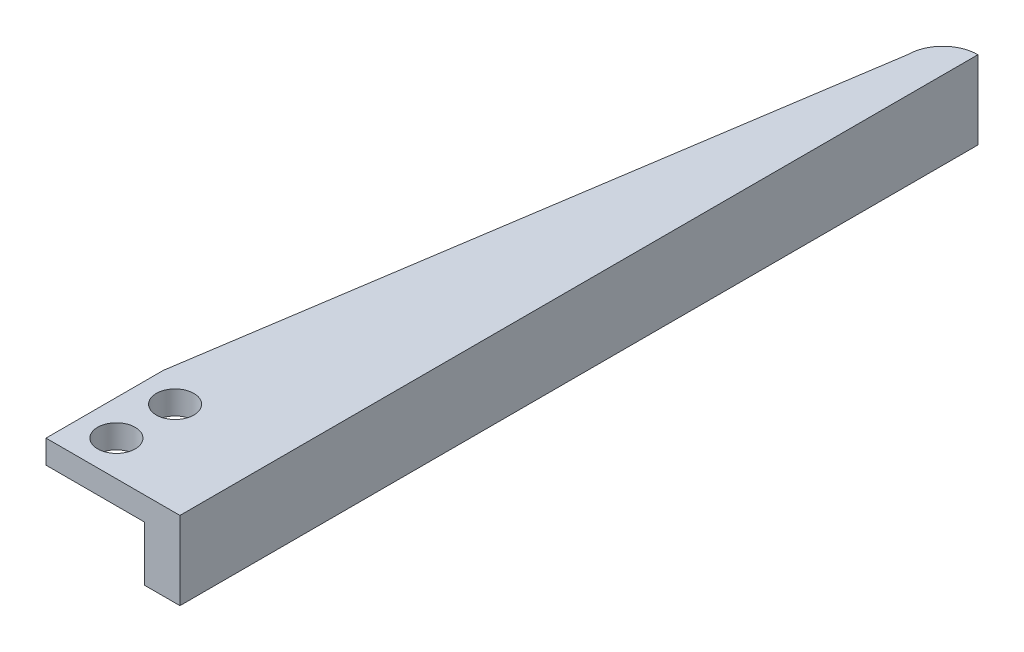
ISO-10303-21;
HEADER;
FILE_DESCRIPTION(('STEP AP214'),'2;1');
FILE_NAME('part.step','',(''),(''),'','','');
FILE_SCHEMA(('AUTOMOTIVE_DESIGN { 1 0 10303 214 1 1 1 1 }'));
ENDSEC;
DATA;
#1=APPLICATION_CONTEXT('core data for automotive mechanical design processes');
#2=APPLICATION_PROTOCOL_DEFINITION('international standard','automotive_design',2000,#1);
#3=PRODUCT_CONTEXT('',#1,'mechanical');
#4=PRODUCT('Part','Part','',(#3));
#5=PRODUCT_RELATED_PRODUCT_CATEGORY('part','',(#4));
#6=PRODUCT_DEFINITION_FORMATION('','',#4);
#7=PRODUCT_DEFINITION_CONTEXT('part definition',#1,'design');
#8=PRODUCT_DEFINITION('design','',#6,#7);
#9=PRODUCT_DEFINITION_SHAPE('','',#8);
#10=(LENGTH_UNIT() NAMED_UNIT(*) SI_UNIT(.MILLI.,.METRE.));
#11=(NAMED_UNIT(*) PLANE_ANGLE_UNIT() SI_UNIT($,.RADIAN.));
#12=(NAMED_UNIT(*) SI_UNIT($,.STERADIAN.) SOLID_ANGLE_UNIT());
#13=UNCERTAINTY_MEASURE_WITH_UNIT(LENGTH_MEASURE(1.E-05),#10,'distance_accuracy_value','');
#14=(GEOMETRIC_REPRESENTATION_CONTEXT(3) GLOBAL_UNCERTAINTY_ASSIGNED_CONTEXT((#13)) GLOBAL_UNIT_ASSIGNED_CONTEXT((#10,
#11,#12)) REPRESENTATION_CONTEXT('',''));
#15=CARTESIAN_POINT('',(0.,0.,0.));
#16=DIRECTION('',(0.,0.,1.));
#17=DIRECTION('',(1.,0.,0.));
#18=AXIS2_PLACEMENT_3D('',#15,#16,#17);
#19=CARTESIAN_POINT('',(5.70625000000002,0.,-65.));
#20=DIRECTION('',(0.,1.,0.));
#21=DIRECTION('',(0.,0.,-1.));
#22=AXIS2_PLACEMENT_3D('',#19,#20,#21);
#23=PLANE('',#22);
#24=CARTESIAN_POINT('',(-2.70625,0.,-8.));
#25=DIRECTION('',(0.,-1.,0.));
#26=DIRECTION('',(0.,0.,-1.));
#27=AXIS2_PLACEMENT_3D('',#24,#25,#26);
#28=CIRCLE('',#27,1.6);
#29=CARTESIAN_POINT('',(-2.70625,0.,-9.6));
#30=VERTEX_POINT('',#29);
#31=EDGE_CURVE('E147',#30,#30,#28,.T.);
#32=ORIENTED_EDGE('',*,*,#31,.F.);
#33=EDGE_LOOP('',(#32));
#34=FACE_BOUND('',#33,.T.);
#35=CARTESIAN_POINT('',(-2.70625,0.,-3.));
#36=DIRECTION('',(0.,-1.,0.));
#37=DIRECTION('',(0.,0.,-1.));
#38=AXIS2_PLACEMENT_3D('',#35,#36,#37);
#39=CIRCLE('',#38,1.6);
#40=CARTESIAN_POINT('',(-2.70625,0.,-4.6));
#41=VERTEX_POINT('',#40);
#42=EDGE_CURVE('E151',#41,#41,#39,.T.);
#43=ORIENTED_EDGE('',*,*,#42,.F.);
#44=EDGE_LOOP('',(#43));
#45=FACE_BOUND('',#44,.T.);
#46=DIRECTION('',(0.,0.,1.));
#47=VECTOR('',#46,1.);
#48=CARTESIAN_POINT('',(2.70625000000002,0.,-65.));
#49=LINE('',#48,#47);
#50=CARTESIAN_POINT('',(2.70625000000002,0.,-65.));
#51=VERTEX_POINT('',#50);
#52=CARTESIAN_POINT('',(2.70625000000003,0.,0.));
#53=VERTEX_POINT('',#52);
#54=EDGE_CURVE('E130',#51,#53,#49,.T.);
#55=ORIENTED_EDGE('',*,*,#54,.T.);
#56=DIRECTION('',(-1.,0.,0.));
#57=VECTOR('',#56,1.);
#58=CARTESIAN_POINT('',(-5.70625,0.,0.));
#59=LINE('',#58,#57);
#60=CARTESIAN_POINT('',(-5.70625,0.,0.));
#61=VERTEX_POINT('',#60);
#62=EDGE_CURVE('E121',#53,#61,#59,.T.);
#63=ORIENTED_EDGE('',*,*,#62,.T.);
#64=DIRECTION('',(0.,0.,-1.));
#65=VECTOR('',#64,1.);
#66=CARTESIAN_POINT('',(-5.70625,0.,0.));
#67=LINE('',#66,#65);
#68=CARTESIAN_POINT('',(-5.70625,0.,-10.));
#69=VERTEX_POINT('',#68);
#70=EDGE_CURVE('E114',#61,#69,#67,.T.);
#71=ORIENTED_EDGE('',*,*,#70,.T.);
#72=DIRECTION('',(0.151196146520445,0.,-0.988503781114351));
#73=VECTOR('',#72,1.);
#74=CARTESIAN_POINT('',(-5.70625,0.,-10.));
#75=LINE('',#74,#73);
#76=EDGE_CURVE('E117',#69,#51,#75,.T.);
#77=ORIENTED_EDGE('',*,*,#76,.T.);
#78=EDGE_LOOP('',(#55,#63,#71,#77));
#79=FACE_BOUND('',#78,.T.);
#80=ADVANCED_FACE('F35',(#34,#45,#79),#23,.F.);
#81=CARTESIAN_POINT('',(5.70625000000002,2.,-65.));
#82=DIRECTION('',(0.,1.,0.));
#83=DIRECTION('',(0.,0.,-1.));
#84=AXIS2_PLACEMENT_3D('',#81,#82,#83);
#85=PLANE('',#84);
#86=CARTESIAN_POINT('',(-2.70625,2.,-3.));
#87=DIRECTION('',(0.,-1.,0.));
#88=DIRECTION('',(0.,0.,-1.));
#89=AXIS2_PLACEMENT_3D('',#86,#87,#88);
#90=CIRCLE('',#89,1.6);
#91=CARTESIAN_POINT('',(-2.70625,2.,-4.6));
#92=VERTEX_POINT('',#91);
#93=EDGE_CURVE('E118',#92,#92,#90,.T.);
#94=ORIENTED_EDGE('',*,*,#93,.T.);
#95=EDGE_LOOP('',(#94));
#96=FACE_BOUND('',#95,.T.);
#97=DIRECTION('',(0.,0.,-1.));
#98=VECTOR('',#97,1.);
#99=CARTESIAN_POINT('',(-5.70625,2.,0.));
#100=LINE('',#99,#98);
#101=CARTESIAN_POINT('',(-5.70625,2.,0.));
#102=VERTEX_POINT('',#101);
#103=CARTESIAN_POINT('',(-5.70625,2.,-10.));
#104=VERTEX_POINT('',#103);
#105=EDGE_CURVE('E124',#102,#104,#100,.T.);
#106=ORIENTED_EDGE('',*,*,#105,.F.);
#107=DIRECTION('',(-1.,0.,0.));
#108=VECTOR('',#107,1.);
#109=CARTESIAN_POINT('',(-5.70625,2.,0.));
#110=LINE('',#109,#108);
#111=CARTESIAN_POINT('',(5.70625,2.,0.));
#112=VERTEX_POINT('',#111);
#113=EDGE_CURVE('E109',#112,#102,#110,.T.);
#114=ORIENTED_EDGE('',*,*,#113,.F.);
#115=DIRECTION('',(0.,0.,1.));
#116=VECTOR('',#115,1.);
#117=CARTESIAN_POINT('',(5.70625000000001,2.,-68.));
#118=LINE('',#117,#116);
#119=CARTESIAN_POINT('',(5.70625000000001,2.,-68.));
#120=VERTEX_POINT('',#119);
#121=EDGE_CURVE('E93',#120,#112,#118,.T.);
#122=ORIENTED_EDGE('',*,*,#121,.F.);
#123=CARTESIAN_POINT('',(5.70625000000002,2.,-65.));
#124=DIRECTION('',(0.,-1.,0.));
#125=DIRECTION('',(0.,0.,-1.));
#126=AXIS2_PLACEMENT_3D('',#123,#124,#125);
#127=CIRCLE('',#126,3.);
#128=CARTESIAN_POINT('',(2.70625000000002,2.,-65.));
#129=VERTEX_POINT('',#128);
#130=EDGE_CURVE('E101',#129,#120,#127,.T.);
#131=ORIENTED_EDGE('',*,*,#130,.F.);
#132=DIRECTION('',(0.151196146520445,0.,-0.988503781114351));
#133=VECTOR('',#132,1.);
#134=CARTESIAN_POINT('',(-5.70625,2.,-10.));
#135=LINE('',#134,#133);
#136=EDGE_CURVE('E104',#104,#129,#135,.T.);
#137=ORIENTED_EDGE('',*,*,#136,.F.);
#138=EDGE_LOOP('',(#106,#114,#122,#131,#137));
#139=FACE_BOUND('',#138,.T.);
#140=CARTESIAN_POINT('',(-2.70625,2.,-8.));
#141=DIRECTION('',(0.,-1.,0.));
#142=DIRECTION('',(0.,0.,-1.));
#143=AXIS2_PLACEMENT_3D('',#140,#141,#142);
#144=CIRCLE('',#143,1.6);
#145=CARTESIAN_POINT('',(-2.70625,2.,-9.6));
#146=VERTEX_POINT('',#145);
#147=EDGE_CURVE('E148',#146,#146,#144,.T.);
#148=ORIENTED_EDGE('',*,*,#147,.T.);
#149=EDGE_LOOP('',(#148));
#150=FACE_BOUND('',#149,.T.);
#151=ADVANCED_FACE('F107',(#96,#139,#150),#85,.T.);
#152=CARTESIAN_POINT('',(-5.70625,2.,0.));
#153=DIRECTION('',(1.,0.,0.));
#154=DIRECTION('',(0.,0.,1.));
#155=AXIS2_PLACEMENT_3D('',#152,#153,#154);
#156=PLANE('',#155);
#157=ORIENTED_EDGE('',*,*,#70,.F.);
#158=DIRECTION('',(0.,-1.,0.));
#159=VECTOR('',#158,1.);
#160=CARTESIAN_POINT('',(-5.70625,2.,0.));
#161=LINE('',#160,#159);
#162=EDGE_CURVE('E52',#102,#61,#161,.T.);
#163=ORIENTED_EDGE('',*,*,#162,.F.);
#164=ORIENTED_EDGE('',*,*,#105,.T.);
#165=DIRECTION('',(0.,-1.,0.));
#166=VECTOR('',#165,1.);
#167=CARTESIAN_POINT('',(-5.70625,2.,-10.));
#168=LINE('',#167,#166);
#169=EDGE_CURVE('E11',#104,#69,#168,.T.);
#170=ORIENTED_EDGE('',*,*,#169,.T.);
#171=EDGE_LOOP('',(#157,#163,#164,#170));
#172=FACE_BOUND('',#171,.T.);
#173=ADVANCED_FACE('F37',(#172),#156,.F.);
#174=CARTESIAN_POINT('',(-5.70625,2.,-10.));
#175=DIRECTION('',(0.988503781114351,0.,0.151196146520445));
#176=DIRECTION('',(-0.151196146520445,0.,0.988503781114351));
#177=AXIS2_PLACEMENT_3D('',#174,#175,#176);
#178=PLANE('',#177);
#179=ORIENTED_EDGE('',*,*,#76,.F.);
#180=ORIENTED_EDGE('',*,*,#169,.F.);
#181=ORIENTED_EDGE('',*,*,#136,.T.);
#182=DIRECTION('',(0.,-1.,0.));
#183=VECTOR('',#182,1.);
#184=CARTESIAN_POINT('',(2.70625000000002,2.,-65.));
#185=LINE('',#184,#183);
#186=EDGE_CURVE('E44',#129,#51,#185,.T.);
#187=ORIENTED_EDGE('',*,*,#186,.T.);
#188=EDGE_LOOP('',(#179,#180,#181,#187));
#189=FACE_BOUND('',#188,.T.);
#190=ADVANCED_FACE('F126',(#189),#178,.F.);
#191=CARTESIAN_POINT('',(5.70625000000002,2.,-65.));
#192=DIRECTION('',(0.,-1.,0.));
#193=DIRECTION('',(0.,0.,1.));
#194=AXIS2_PLACEMENT_3D('',#191,#192,#193);
#195=CYLINDRICAL_SURFACE('',#194,3.);
#196=ORIENTED_EDGE('',*,*,#186,.F.);
#197=ORIENTED_EDGE('',*,*,#130,.T.);
#198=DIRECTION('',(0.,-1.,0.));
#199=VECTOR('',#198,1.);
#200=CARTESIAN_POINT('',(5.70625000000001,2.,-68.));
#201=LINE('',#200,#199);
#202=CARTESIAN_POINT('',(5.70625000000001,-4.6625,-68.));
#203=VERTEX_POINT('',#202);
#204=EDGE_CURVE('E88',#120,#203,#201,.T.);
#205=ORIENTED_EDGE('',*,*,#204,.T.);
#206=CARTESIAN_POINT('',(5.70625000000002,-4.6625,-65.));
#207=DIRECTION('',(0.,1.,0.));
#208=DIRECTION('',(0.,0.,1.));
#209=AXIS2_PLACEMENT_3D('',#206,#207,#208);
#210=CIRCLE('',#209,3.);
#211=CARTESIAN_POINT('',(2.70625000000002,-4.6625,-65.));
#212=VERTEX_POINT('',#211);
#213=EDGE_CURVE('E138',#203,#212,#210,.T.);
#214=ORIENTED_EDGE('',*,*,#213,.T.);
#215=DIRECTION('',(0.,1.,0.));
#216=VECTOR('',#215,1.);
#217=CARTESIAN_POINT('',(2.70625000000002,-4.6625,-65.));
#218=LINE('',#217,#216);
#219=EDGE_CURVE('E67',#212,#51,#218,.T.);
#220=ORIENTED_EDGE('',*,*,#219,.T.);
#221=EDGE_LOOP('',(#196,#197,#205,#214,#220));
#222=FACE_BOUND('',#221,.T.);
#223=ADVANCED_FACE('F102',(#222),#195,.T.);
#224=CARTESIAN_POINT('',(5.70625000000001,2.,-68.));
#225=DIRECTION('',(-1.,0.,0.));
#226=DIRECTION('',(0.,0.,-1.));
#227=AXIS2_PLACEMENT_3D('',#224,#225,#226);
#228=PLANE('',#227);
#229=ORIENTED_EDGE('',*,*,#204,.F.);
#230=ORIENTED_EDGE('',*,*,#121,.T.);
#231=DIRECTION('',(0.,-1.,0.));
#232=VECTOR('',#231,1.);
#233=CARTESIAN_POINT('',(5.70625,2.,0.));
#234=LINE('',#233,#232);
#235=CARTESIAN_POINT('',(5.70625000000002,-4.6625,0.));
#236=VERTEX_POINT('',#235);
#237=EDGE_CURVE('E98',#112,#236,#234,.T.);
#238=ORIENTED_EDGE('',*,*,#237,.T.);
#239=DIRECTION('',(0.,0.,-1.));
#240=VECTOR('',#239,1.);
#241=CARTESIAN_POINT('',(5.70625000000001,-4.6625,-68.));
#242=LINE('',#241,#240);
#243=EDGE_CURVE('E96',#236,#203,#242,.T.);
#244=ORIENTED_EDGE('',*,*,#243,.T.);
#245=EDGE_LOOP('',(#229,#230,#238,#244));
#246=FACE_BOUND('',#245,.T.);
#247=ADVANCED_FACE('F90',(#246),#228,.F.);
#248=CARTESIAN_POINT('',(-5.70625,2.,0.));
#249=DIRECTION('',(0.,0.,-1.));
#250=DIRECTION('',(1.,0.,0.));
#251=AXIS2_PLACEMENT_3D('',#248,#249,#250);
#252=PLANE('',#251);
#253=ORIENTED_EDGE('',*,*,#237,.F.);
#254=ORIENTED_EDGE('',*,*,#113,.T.);
#255=ORIENTED_EDGE('',*,*,#162,.T.);
#256=ORIENTED_EDGE('',*,*,#62,.F.);
#257=DIRECTION('',(0.,1.,0.));
#258=VECTOR('',#257,1.);
#259=CARTESIAN_POINT('',(2.70625000000003,-4.6625,0.));
#260=LINE('',#259,#258);
#261=CARTESIAN_POINT('',(2.70625000000003,-4.6625,0.));
#262=VERTEX_POINT('',#261);
#263=EDGE_CURVE('E137',#262,#53,#260,.T.);
#264=ORIENTED_EDGE('',*,*,#263,.F.);
#265=DIRECTION('',(1.,0.,0.));
#266=VECTOR('',#265,1.);
#267=CARTESIAN_POINT('',(5.70625000000002,-4.6625,0.));
#268=LINE('',#267,#266);
#269=EDGE_CURVE('E168',#262,#236,#268,.T.);
#270=ORIENTED_EDGE('',*,*,#269,.T.);
#271=EDGE_LOOP('',(#253,#254,#255,#256,#264,#270));
#272=FACE_BOUND('',#271,.T.);
#273=ADVANCED_FACE('F158',(#272),#252,.F.);
#274=CARTESIAN_POINT('',(-2.70625,2.,-3.));
#275=DIRECTION('',(0.,-1.,0.));
#276=DIRECTION('',(0.,0.,1.));
#277=AXIS2_PLACEMENT_3D('',#274,#275,#276);
#278=CYLINDRICAL_SURFACE('',#277,1.6);
#279=ORIENTED_EDGE('',*,*,#93,.F.);
#280=EDGE_LOOP('',(#279));
#281=FACE_BOUND('',#280,.T.);
#282=ORIENTED_EDGE('',*,*,#42,.T.);
#283=EDGE_LOOP('',(#282));
#284=FACE_BOUND('',#283,.T.);
#285=ADVANCED_FACE('F191',(#281,#284),#278,.F.);
#286=CARTESIAN_POINT('',(-2.70625,2.,-8.));
#287=DIRECTION('',(0.,-1.,0.));
#288=DIRECTION('',(0.,0.,1.));
#289=AXIS2_PLACEMENT_3D('',#286,#287,#288);
#290=CYLINDRICAL_SURFACE('',#289,1.6);
#291=ORIENTED_EDGE('',*,*,#147,.F.);
#292=EDGE_LOOP('',(#291));
#293=FACE_BOUND('',#292,.T.);
#294=ORIENTED_EDGE('',*,*,#31,.T.);
#295=EDGE_LOOP('',(#294));
#296=FACE_BOUND('',#295,.T.);
#297=ADVANCED_FACE('F175',(#293,#296),#290,.F.);
#298=CARTESIAN_POINT('',(2.70625000000002,-4.6625,-65.));
#299=DIRECTION('',(1.,0.,0.));
#300=DIRECTION('',(0.,0.,1.));
#301=AXIS2_PLACEMENT_3D('',#298,#299,#300);
#302=PLANE('',#301);
#303=ORIENTED_EDGE('',*,*,#54,.F.);
#304=ORIENTED_EDGE('',*,*,#219,.F.);
#305=DIRECTION('',(0.,0.,1.));
#306=VECTOR('',#305,1.);
#307=CARTESIAN_POINT('',(2.70625000000002,-4.6625,-65.));
#308=LINE('',#307,#306);
#309=EDGE_CURVE('E140',#212,#262,#308,.T.);
#310=ORIENTED_EDGE('',*,*,#309,.T.);
#311=ORIENTED_EDGE('',*,*,#263,.T.);
#312=EDGE_LOOP('',(#303,#304,#310,#311));
#313=FACE_BOUND('',#312,.T.);
#314=ADVANCED_FACE('F133',(#313),#302,.F.);
#315=CARTESIAN_POINT('',(5.70625000000002,-4.6625,-65.));
#316=DIRECTION('',(0.,-1.,0.));
#317=DIRECTION('',(0.,0.,1.));
#318=AXIS2_PLACEMENT_3D('',#315,#316,#317);
#319=PLANE('',#318);
#320=ORIENTED_EDGE('',*,*,#213,.F.);
#321=ORIENTED_EDGE('',*,*,#243,.F.);
#322=ORIENTED_EDGE('',*,*,#269,.F.);
#323=ORIENTED_EDGE('',*,*,#309,.F.);
#324=EDGE_LOOP('',(#320,#321,#322,#323));
#325=FACE_BOUND('',#324,.T.);
#326=ADVANCED_FACE('F169',(#325),#319,.T.);
#327=CLOSED_SHELL('',(#80,#151,#173,#190,#223,#247,#273,#285,#297,#314,#326));
#328=MANIFOLD_SOLID_BREP('B2',#327);
#329=ADVANCED_BREP_SHAPE_REPRESENTATION('',(#18,#328),#14);
#330=SHAPE_DEFINITION_REPRESENTATION(#9,#329);
ENDSEC;
END-ISO-10303-21;
